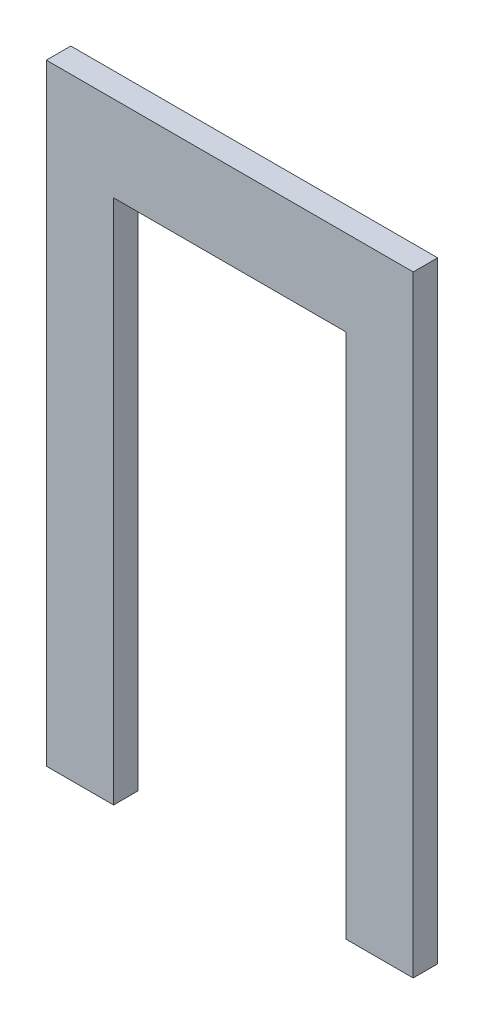
ISO-10303-21;
HEADER;
FILE_DESCRIPTION(('STEP AP214'),'2;1');
FILE_NAME('part.step','',(''),(''),'','','');
FILE_SCHEMA(('AUTOMOTIVE_DESIGN { 1 0 10303 214 1 1 1 1 }'));
ENDSEC;
DATA;
#1=APPLICATION_CONTEXT('core data for automotive mechanical design processes');
#2=APPLICATION_PROTOCOL_DEFINITION('international standard','automotive_design',2000,#1);
#3=PRODUCT_CONTEXT('',#1,'mechanical');
#4=PRODUCT('Part','Part','',(#3));
#5=PRODUCT_RELATED_PRODUCT_CATEGORY('part','',(#4));
#6=PRODUCT_DEFINITION_FORMATION('','',#4);
#7=PRODUCT_DEFINITION_CONTEXT('part definition',#1,'design');
#8=PRODUCT_DEFINITION('design','',#6,#7);
#9=PRODUCT_DEFINITION_SHAPE('','',#8);
#10=(LENGTH_UNIT() NAMED_UNIT(*) SI_UNIT(.MILLI.,.METRE.));
#11=(NAMED_UNIT(*) PLANE_ANGLE_UNIT() SI_UNIT($,.RADIAN.));
#12=(NAMED_UNIT(*) SI_UNIT($,.STERADIAN.) SOLID_ANGLE_UNIT());
#13=UNCERTAINTY_MEASURE_WITH_UNIT(LENGTH_MEASURE(1.E-05),#10,'distance_accuracy_value','');
#14=(GEOMETRIC_REPRESENTATION_CONTEXT(3) GLOBAL_UNCERTAINTY_ASSIGNED_CONTEXT((#13)) GLOBAL_UNIT_ASSIGNED_CONTEXT((#10,
#11,#12)) REPRESENTATION_CONTEXT('',''));
#15=CARTESIAN_POINT('',(0.,0.,0.));
#16=DIRECTION('',(0.,0.,1.));
#17=DIRECTION('',(1.,0.,0.));
#18=AXIS2_PLACEMENT_3D('',#15,#16,#17);
#19=CARTESIAN_POINT('',(0.,899.999999999999,100.));
#20=DIRECTION('',(0.,1.,0.));
#21=DIRECTION('',(0.,0.,1.));
#22=AXIS2_PLACEMENT_3D('',#19,#20,#21);
#23=PLANE('',#22);
#24=DIRECTION('',(1.,0.,0.));
#25=VECTOR('',#24,1.);
#26=CARTESIAN_POINT('',(0.,899.999999999999,0.));
#27=LINE('',#26,#25);
#28=CARTESIAN_POINT('',(-475.,899.999999999999,0.));
#29=VERTEX_POINT('',#28);
#30=CARTESIAN_POINT('',(475.,899.999999999999,0.));
#31=VERTEX_POINT('',#30);
#32=EDGE_CURVE('E134',#29,#31,#27,.T.);
#33=ORIENTED_EDGE('',*,*,#32,.T.);
#34=DIRECTION('',(0.,0.,-1.));
#35=VECTOR('',#34,1.);
#36=CARTESIAN_POINT('',(475.,899.999999999999,100.));
#37=LINE('',#36,#35);
#38=CARTESIAN_POINT('',(475.,899.999999999999,100.));
#39=VERTEX_POINT('',#38);
#40=EDGE_CURVE('E11',#39,#31,#37,.T.);
#41=ORIENTED_EDGE('',*,*,#40,.F.);
#42=DIRECTION('',(1.,0.,0.));
#43=VECTOR('',#42,1.);
#44=CARTESIAN_POINT('',(0.,899.999999999999,100.));
#45=LINE('',#44,#43);
#46=CARTESIAN_POINT('',(-475.,899.999999999999,100.));
#47=VERTEX_POINT('',#46);
#48=EDGE_CURVE('E151',#47,#39,#45,.T.);
#49=ORIENTED_EDGE('',*,*,#48,.F.);
#50=DIRECTION('',(0.,0.,-1.));
#51=VECTOR('',#50,1.);
#52=CARTESIAN_POINT('',(-475.,899.999999999999,100.));
#53=LINE('',#52,#51);
#54=EDGE_CURVE('E51',#47,#29,#53,.T.);
#55=ORIENTED_EDGE('',*,*,#54,.T.);
#56=EDGE_LOOP('',(#33,#41,#49,#55));
#57=FACE_BOUND('',#56,.T.);
#58=ADVANCED_FACE('F35',(#57),#23,.F.);
#59=CARTESIAN_POINT('',(475.,0.,100.));
#60=DIRECTION('',(1.,0.,0.));
#61=DIRECTION('',(0.,1.,0.));
#62=AXIS2_PLACEMENT_3D('',#59,#60,#61);
#63=PLANE('',#62);
#64=DIRECTION('',(0.,-1.,0.));
#65=VECTOR('',#64,1.);
#66=CARTESIAN_POINT('',(475.,0.,0.));
#67=LINE('',#66,#65);
#68=CARTESIAN_POINT('',(475.,-1250.,0.));
#69=VERTEX_POINT('',#68);
#70=EDGE_CURVE('E136',#31,#69,#67,.T.);
#71=ORIENTED_EDGE('',*,*,#70,.T.);
#72=DIRECTION('',(0.,0.,-1.));
#73=VECTOR('',#72,1.);
#74=CARTESIAN_POINT('',(475.,-1250.,100.));
#75=LINE('',#74,#73);
#76=CARTESIAN_POINT('',(475.,-1250.,100.));
#77=VERTEX_POINT('',#76);
#78=EDGE_CURVE('E43',#77,#69,#75,.T.);
#79=ORIENTED_EDGE('',*,*,#78,.F.);
#80=DIRECTION('',(0.,-1.,0.));
#81=VECTOR('',#80,1.);
#82=CARTESIAN_POINT('',(475.,0.,100.));
#83=LINE('',#82,#81);
#84=EDGE_CURVE('E90',#39,#77,#83,.T.);
#85=ORIENTED_EDGE('',*,*,#84,.F.);
#86=ORIENTED_EDGE('',*,*,#40,.T.);
#87=EDGE_LOOP('',(#71,#79,#85,#86));
#88=FACE_BOUND('',#87,.T.);
#89=ADVANCED_FACE('F176',(#88),#63,.F.);
#90=CARTESIAN_POINT('',(0.,-1250.,100.));
#91=DIRECTION('',(0.,1.,0.));
#92=DIRECTION('',(0.,0.,1.));
#93=AXIS2_PLACEMENT_3D('',#90,#91,#92);
#94=PLANE('',#93);
#95=DIRECTION('',(1.,0.,0.));
#96=VECTOR('',#95,1.);
#97=CARTESIAN_POINT('',(0.,-1250.,0.));
#98=LINE('',#97,#96);
#99=CARTESIAN_POINT('',(749.999999999999,-1250.,0.));
#100=VERTEX_POINT('',#99);
#101=EDGE_CURVE('E138',#69,#100,#98,.T.);
#102=ORIENTED_EDGE('',*,*,#101,.T.);
#103=DIRECTION('',(0.,0.,-1.));
#104=VECTOR('',#103,1.);
#105=CARTESIAN_POINT('',(749.999999999999,-1250.,100.));
#106=LINE('',#105,#104);
#107=CARTESIAN_POINT('',(749.999999999999,-1250.,100.));
#108=VERTEX_POINT('',#107);
#109=EDGE_CURVE('E157',#108,#100,#106,.T.);
#110=ORIENTED_EDGE('',*,*,#109,.F.);
#111=DIRECTION('',(1.,0.,0.));
#112=VECTOR('',#111,1.);
#113=CARTESIAN_POINT('',(0.,-1250.,100.));
#114=LINE('',#113,#112);
#115=EDGE_CURVE('E123',#77,#108,#114,.T.);
#116=ORIENTED_EDGE('',*,*,#115,.F.);
#117=ORIENTED_EDGE('',*,*,#78,.T.);
#118=EDGE_LOOP('',(#102,#110,#116,#117));
#119=FACE_BOUND('',#118,.T.);
#120=ADVANCED_FACE('F163',(#119),#94,.F.);
#121=CARTESIAN_POINT('',(749.999999999999,0.,100.));
#122=DIRECTION('',(-1.,0.,0.));
#123=DIRECTION('',(0.,0.,1.));
#124=AXIS2_PLACEMENT_3D('',#121,#122,#123);
#125=PLANE('',#124);
#126=DIRECTION('',(0.,1.,0.));
#127=VECTOR('',#126,1.);
#128=CARTESIAN_POINT('',(749.999999999999,0.,0.));
#129=LINE('',#128,#127);
#130=CARTESIAN_POINT('',(749.999999999999,1250.,0.));
#131=VERTEX_POINT('',#130);
#132=EDGE_CURVE('E140',#100,#131,#129,.T.);
#133=ORIENTED_EDGE('',*,*,#132,.T.);
#134=DIRECTION('',(0.,0.,-1.));
#135=VECTOR('',#134,1.);
#136=CARTESIAN_POINT('',(749.999999999999,1250.,100.));
#137=LINE('',#136,#135);
#138=CARTESIAN_POINT('',(749.999999999999,1250.,100.));
#139=VERTEX_POINT('',#138);
#140=EDGE_CURVE('E155',#139,#131,#137,.T.);
#141=ORIENTED_EDGE('',*,*,#140,.F.);
#142=DIRECTION('',(0.,1.,0.));
#143=VECTOR('',#142,1.);
#144=CARTESIAN_POINT('',(749.999999999999,0.,100.));
#145=LINE('',#144,#143);
#146=EDGE_CURVE('E129',#108,#139,#145,.T.);
#147=ORIENTED_EDGE('',*,*,#146,.F.);
#148=ORIENTED_EDGE('',*,*,#109,.T.);
#149=EDGE_LOOP('',(#133,#141,#147,#148));
#150=FACE_BOUND('',#149,.T.);
#151=ADVANCED_FACE('F171',(#150),#125,.F.);
#152=CARTESIAN_POINT('',(0.,1250.,100.));
#153=DIRECTION('',(0.,1.,0.));
#154=DIRECTION('',(0.,0.,1.));
#155=AXIS2_PLACEMENT_3D('',#152,#153,#154);
#156=PLANE('',#155);
#157=DIRECTION('',(1.,0.,0.));
#158=VECTOR('',#157,1.);
#159=CARTESIAN_POINT('',(0.,1250.,0.));
#160=LINE('',#159,#158);
#161=CARTESIAN_POINT('',(-750.000000000001,1250.,0.));
#162=VERTEX_POINT('',#161);
#163=EDGE_CURVE('E144',#162,#131,#160,.T.);
#164=ORIENTED_EDGE('',*,*,#163,.F.);
#165=DIRECTION('',(0.,0.,-1.));
#166=VECTOR('',#165,1.);
#167=CARTESIAN_POINT('',(-750.000000000001,1250.,100.));
#168=LINE('',#167,#166);
#169=CARTESIAN_POINT('',(-750.000000000001,1250.,100.));
#170=VERTEX_POINT('',#169);
#171=EDGE_CURVE('E115',#170,#162,#168,.T.);
#172=ORIENTED_EDGE('',*,*,#171,.F.);
#173=DIRECTION('',(1.,0.,0.));
#174=VECTOR('',#173,1.);
#175=CARTESIAN_POINT('',(0.,1250.,100.));
#176=LINE('',#175,#174);
#177=EDGE_CURVE('E127',#170,#139,#176,.T.);
#178=ORIENTED_EDGE('',*,*,#177,.T.);
#179=ORIENTED_EDGE('',*,*,#140,.T.);
#180=EDGE_LOOP('',(#164,#172,#178,#179));
#181=FACE_BOUND('',#180,.T.);
#182=ADVANCED_FACE('F186',(#181),#156,.T.);
#183=CARTESIAN_POINT('',(-750.000000000001,0.,100.));
#184=DIRECTION('',(-1.,0.,0.));
#185=DIRECTION('',(0.,0.,1.));
#186=AXIS2_PLACEMENT_3D('',#183,#184,#185);
#187=PLANE('',#186);
#188=DIRECTION('',(0.,1.,0.));
#189=VECTOR('',#188,1.);
#190=CARTESIAN_POINT('',(-750.000000000001,0.,0.));
#191=LINE('',#190,#189);
#192=CARTESIAN_POINT('',(-750.000000000001,-1250.,0.));
#193=VERTEX_POINT('',#192);
#194=EDGE_CURVE('E112',#193,#162,#191,.T.);
#195=ORIENTED_EDGE('',*,*,#194,.F.);
#196=DIRECTION('',(0.,0.,-1.));
#197=VECTOR('',#196,1.);
#198=CARTESIAN_POINT('',(-750.000000000001,-1250.,100.));
#199=LINE('',#198,#197);
#200=CARTESIAN_POINT('',(-750.000000000001,-1250.,100.));
#201=VERTEX_POINT('',#200);
#202=EDGE_CURVE('E106',#201,#193,#199,.T.);
#203=ORIENTED_EDGE('',*,*,#202,.F.);
#204=DIRECTION('',(0.,1.,0.));
#205=VECTOR('',#204,1.);
#206=CARTESIAN_POINT('',(-750.000000000001,0.,100.));
#207=LINE('',#206,#205);
#208=EDGE_CURVE('E110',#201,#170,#207,.T.);
#209=ORIENTED_EDGE('',*,*,#208,.T.);
#210=ORIENTED_EDGE('',*,*,#171,.T.);
#211=EDGE_LOOP('',(#195,#203,#209,#210));
#212=FACE_BOUND('',#211,.T.);
#213=ADVANCED_FACE('F108',(#212),#187,.T.);
#214=CARTESIAN_POINT('',(-475.,-1250.,0.));
#215=VERTEX_POINT('',#214);
#216=EDGE_CURVE('E141',#193,#215,#98,.T.);
#217=ORIENTED_EDGE('',*,*,#216,.T.);
#218=DIRECTION('',(0.,0.,-1.));
#219=VECTOR('',#218,1.);
#220=CARTESIAN_POINT('',(-475.,-1250.,100.));
#221=LINE('',#220,#219);
#222=CARTESIAN_POINT('',(-475.,-1250.,100.));
#223=VERTEX_POINT('',#222);
#224=EDGE_CURVE('E78',#223,#215,#221,.T.);
#225=ORIENTED_EDGE('',*,*,#224,.F.);
#226=EDGE_CURVE('E117',#201,#223,#114,.T.);
#227=ORIENTED_EDGE('',*,*,#226,.F.);
#228=ORIENTED_EDGE('',*,*,#202,.T.);
#229=EDGE_LOOP('',(#217,#225,#227,#228));
#230=FACE_BOUND('',#229,.T.);
#231=ADVANCED_FACE('F118',(#230),#94,.F.);
#232=CARTESIAN_POINT('',(-475.,0.,100.));
#233=DIRECTION('',(1.,0.,0.));
#234=DIRECTION('',(0.,1.,0.));
#235=AXIS2_PLACEMENT_3D('',#232,#233,#234);
#236=PLANE('',#235);
#237=DIRECTION('',(0.,-1.,0.));
#238=VECTOR('',#237,1.);
#239=CARTESIAN_POINT('',(-475.,0.,0.));
#240=LINE('',#239,#238);
#241=EDGE_CURVE('E148',#29,#215,#240,.T.);
#242=ORIENTED_EDGE('',*,*,#241,.F.);
#243=ORIENTED_EDGE('',*,*,#54,.F.);
#244=DIRECTION('',(0.,-1.,0.));
#245=VECTOR('',#244,1.);
#246=CARTESIAN_POINT('',(-475.,0.,100.));
#247=LINE('',#246,#245);
#248=EDGE_CURVE('E121',#47,#223,#247,.T.);
#249=ORIENTED_EDGE('',*,*,#248,.T.);
#250=ORIENTED_EDGE('',*,*,#224,.T.);
#251=EDGE_LOOP('',(#242,#243,#249,#250));
#252=FACE_BOUND('',#251,.T.);
#253=ADVANCED_FACE('F193',(#252),#236,.T.);
#254=CARTESIAN_POINT('',(0.,0.,100.));
#255=DIRECTION('',(0.,0.,1.));
#256=DIRECTION('',(1.,0.,0.));
#257=AXIS2_PLACEMENT_3D('',#254,#255,#256);
#258=PLANE('',#257);
#259=ORIENTED_EDGE('',*,*,#48,.T.);
#260=ORIENTED_EDGE('',*,*,#84,.T.);
#261=ORIENTED_EDGE('',*,*,#115,.T.);
#262=ORIENTED_EDGE('',*,*,#146,.T.);
#263=ORIENTED_EDGE('',*,*,#177,.F.);
#264=ORIENTED_EDGE('',*,*,#208,.F.);
#265=ORIENTED_EDGE('',*,*,#226,.T.);
#266=ORIENTED_EDGE('',*,*,#248,.F.);
#267=EDGE_LOOP('',(#259,#260,#261,#262,#263,#264,#265,#266));
#268=FACE_BOUND('',#267,.T.);
#269=ADVANCED_FACE('F125',(#268),#258,.T.);
#270=CARTESIAN_POINT('',(0.,0.,0.));
#271=DIRECTION('',(0.,0.,1.));
#272=DIRECTION('',(1.,0.,0.));
#273=AXIS2_PLACEMENT_3D('',#270,#271,#272);
#274=PLANE('',#273);
#275=ORIENTED_EDGE('',*,*,#32,.F.);
#276=ORIENTED_EDGE('',*,*,#241,.T.);
#277=ORIENTED_EDGE('',*,*,#216,.F.);
#278=ORIENTED_EDGE('',*,*,#194,.T.);
#279=ORIENTED_EDGE('',*,*,#163,.T.);
#280=ORIENTED_EDGE('',*,*,#132,.F.);
#281=ORIENTED_EDGE('',*,*,#101,.F.);
#282=ORIENTED_EDGE('',*,*,#70,.F.);
#283=EDGE_LOOP('',(#275,#276,#277,#278,#279,#280,#281,#282));
#284=FACE_BOUND('',#283,.T.);
#285=ADVANCED_FACE('F167',(#284),#274,.F.);
#286=CLOSED_SHELL('',(#58,#89,#120,#151,#182,#213,#231,#253,#269,#285));
#287=MANIFOLD_SOLID_BREP('B2',#286);
#288=ADVANCED_BREP_SHAPE_REPRESENTATION('',(#18,#287),#14);
#289=SHAPE_DEFINITION_REPRESENTATION(#9,#288);
ENDSEC;
END-ISO-10303-21;
